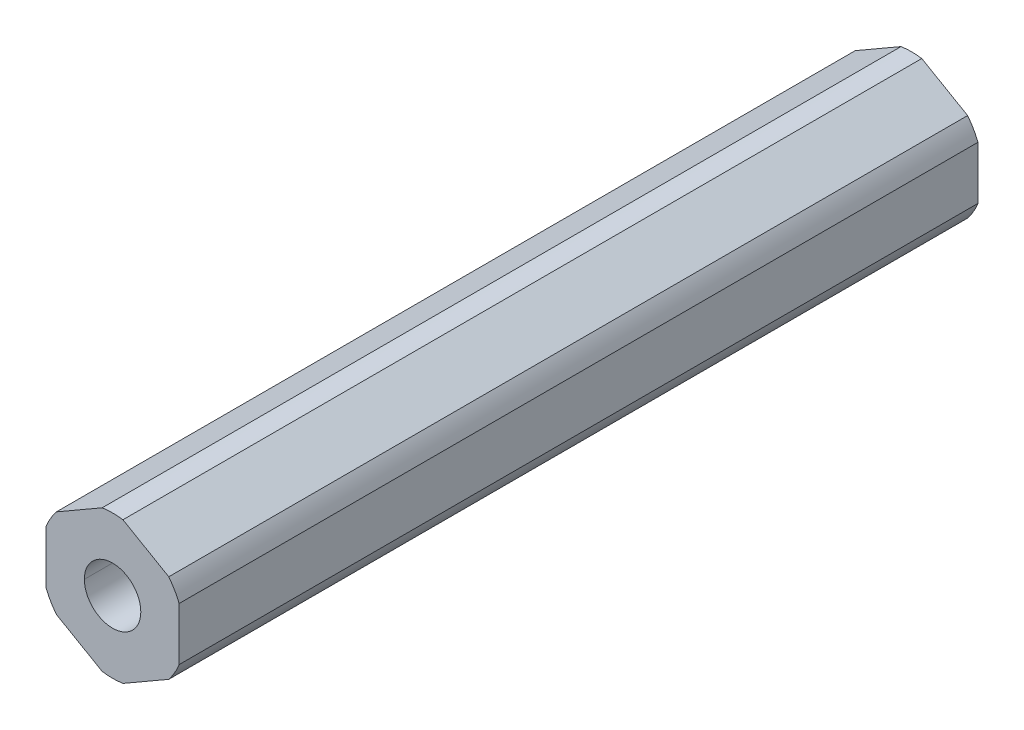
ISO-10303-21;
HEADER;
FILE_DESCRIPTION(('STEP AP214'),'2;1');
FILE_NAME('part.step','',(''),(''),'','','');
FILE_SCHEMA(('AUTOMOTIVE_DESIGN { 1 0 10303 214 1 1 1 1 }'));
ENDSEC;
DATA;
#1=APPLICATION_CONTEXT('core data for automotive mechanical design processes');
#2=APPLICATION_PROTOCOL_DEFINITION('international standard','automotive_design',2000,#1);
#3=PRODUCT_CONTEXT('',#1,'mechanical');
#4=PRODUCT('Part','Part','',(#3));
#5=PRODUCT_RELATED_PRODUCT_CATEGORY('part','',(#4));
#6=PRODUCT_DEFINITION_FORMATION('','',#4);
#7=PRODUCT_DEFINITION_CONTEXT('part definition',#1,'design');
#8=PRODUCT_DEFINITION('design','',#6,#7);
#9=PRODUCT_DEFINITION_SHAPE('','',#8);
#10=(LENGTH_UNIT() NAMED_UNIT(*) SI_UNIT(.MILLI.,.METRE.));
#11=(NAMED_UNIT(*) PLANE_ANGLE_UNIT() SI_UNIT($,.RADIAN.));
#12=(NAMED_UNIT(*) SI_UNIT($,.STERADIAN.) SOLID_ANGLE_UNIT());
#13=UNCERTAINTY_MEASURE_WITH_UNIT(LENGTH_MEASURE(1.E-05),#10,'distance_accuracy_value','');
#14=(GEOMETRIC_REPRESENTATION_CONTEXT(3) GLOBAL_UNCERTAINTY_ASSIGNED_CONTEXT((#13)) GLOBAL_UNIT_ASSIGNED_CONTEXT((#10,
#11,#12)) REPRESENTATION_CONTEXT('',''));
#15=CARTESIAN_POINT('',(0.,0.,0.));
#16=DIRECTION('',(0.,0.,1.));
#17=DIRECTION('',(1.,0.,0.));
#18=AXIS2_PLACEMENT_3D('',#15,#16,#17);
#19=CARTESIAN_POINT('',(0.,0.,-28.575));
#20=DIRECTION('',(0.,0.,-1.));
#21=DIRECTION('',(-1.,0.,0.));
#22=AXIS2_PLACEMENT_3D('',#19,#20,#21);
#23=CYLINDRICAL_SURFACE('',#22,2.0193);
#24=DIRECTION('',(0.,0.,-1.));
#25=VECTOR('',#24,1.);
#26=CARTESIAN_POINT('',(2.0193,0.,-28.575));
#27=LINE('',#26,#25);
#28=CARTESIAN_POINT('',(2.0193,0.,-3.175));
#29=VERTEX_POINT('',#28);
#30=CARTESIAN_POINT('',(2.0193,0.,-28.575));
#31=VERTEX_POINT('',#30);
#32=EDGE_CURVE('E334',#29,#31,#27,.T.);
#33=ORIENTED_EDGE('',*,*,#32,.F.);
#34=CARTESIAN_POINT('',(0.,0.,-3.175));
#35=DIRECTION('',(0.,0.,-1.));
#36=DIRECTION('',(-1.,0.,0.));
#37=AXIS2_PLACEMENT_3D('',#34,#35,#36);
#38=CIRCLE('',#37,2.0193);
#39=CARTESIAN_POINT('',(-2.0193,0.,-3.175));
#40=VERTEX_POINT('',#39);
#41=EDGE_CURVE('E10',#40,#29,#38,.T.);
#42=ORIENTED_EDGE('',*,*,#41,.F.);
#43=DIRECTION('',(0.,0.,-1.));
#44=VECTOR('',#43,1.);
#45=CARTESIAN_POINT('',(-2.0193,0.,-28.575));
#46=LINE('',#45,#44);
#47=CARTESIAN_POINT('',(-2.0193,0.,-28.575));
#48=VERTEX_POINT('',#47);
#49=EDGE_CURVE('E321',#40,#48,#46,.T.);
#50=ORIENTED_EDGE('',*,*,#49,.T.);
#51=CARTESIAN_POINT('',(0.,0.,-28.575));
#52=DIRECTION('',(0.,0.,-1.));
#53=DIRECTION('',(-1.,0.,0.));
#54=AXIS2_PLACEMENT_3D('',#51,#52,#53);
#55=CIRCLE('',#54,2.0193);
#56=EDGE_CURVE('E175',#48,#31,#55,.T.);
#57=ORIENTED_EDGE('',*,*,#56,.T.);
#58=EDGE_LOOP('',(#33,#42,#50,#57));
#59=FACE_BOUND('',#58,.T.);
#60=ADVANCED_FACE('F16',(#59),#23,.F.);
#61=CARTESIAN_POINT('',(0.,0.,-3.175));
#62=DIRECTION('',(0.,0.,-1.));
#63=DIRECTION('',(-1.,0.,0.));
#64=AXIS2_PLACEMENT_3D('',#61,#62,#63);
#65=CONICAL_SURFACE('',#64,2.0193,1.02974425867665);
#66=DIRECTION('',(0.857167300702111,0.,-0.515038074910057));
#67=VECTOR('',#66,1.);
#68=CARTESIAN_POINT('',(2.0193,0.,-3.175));
#69=LINE('',#68,#67);
#70=CARTESIAN_POINT('',(2.01803,0.,-3.17423690701384));
#71=VERTEX_POINT('',#70);
#72=EDGE_CURVE('E243',#71,#29,#69,.T.);
#73=ORIENTED_EDGE('',*,*,#72,.F.);
#74=CARTESIAN_POINT('',(0.,0.,-3.17423690701384));
#75=DIRECTION('',(0.,0.,1.));
#76=DIRECTION('',(-1.,0.,0.));
#77=AXIS2_PLACEMENT_3D('',#74,#75,#76);
#78=CIRCLE('',#77,2.01803);
#79=CARTESIAN_POINT('',(-2.01803,0.,-3.17423690701384));
#80=VERTEX_POINT('',#79);
#81=EDGE_CURVE('E301',#71,#80,#78,.T.);
#82=ORIENTED_EDGE('',*,*,#81,.T.);
#83=DIRECTION('',(-0.857167300702111,0.,-0.515038074910057));
#84=VECTOR('',#83,1.);
#85=CARTESIAN_POINT('',(-2.0193,0.,-3.175));
#86=LINE('',#85,#84);
#87=EDGE_CURVE('E234',#80,#40,#86,.T.);
#88=ORIENTED_EDGE('',*,*,#87,.T.);
#89=ORIENTED_EDGE('',*,*,#41,.T.);
#90=EDGE_LOOP('',(#73,#82,#88,#89));
#91=FACE_BOUND('',#90,.T.);
#92=ADVANCED_FACE('F18',(#91),#65,.F.);
#93=CARTESIAN_POINT('',(0.,0.,28.575));
#94=DIRECTION('',(0.,0.,1.));
#95=DIRECTION('',(1.,0.,0.));
#96=AXIS2_PLACEMENT_3D('',#93,#94,#95);
#97=CYLINDRICAL_SURFACE('',#96,2.0193);
#98=DIRECTION('',(0.,0.,1.));
#99=VECTOR('',#98,1.);
#100=CARTESIAN_POINT('',(-2.0193,0.,28.575));
#101=LINE('',#100,#99);
#102=CARTESIAN_POINT('',(-2.0193,0.,3.175));
#103=VERTEX_POINT('',#102);
#104=CARTESIAN_POINT('',(-2.0193,0.,28.575));
#105=VERTEX_POINT('',#104);
#106=EDGE_CURVE('E202',#103,#105,#101,.T.);
#107=ORIENTED_EDGE('',*,*,#106,.F.);
#108=CARTESIAN_POINT('',(0.,0.,3.175));
#109=DIRECTION('',(0.,0.,1.));
#110=DIRECTION('',(1.,0.,0.));
#111=AXIS2_PLACEMENT_3D('',#108,#109,#110);
#112=CIRCLE('',#111,2.0193);
#113=CARTESIAN_POINT('',(2.0193,0.,3.175));
#114=VERTEX_POINT('',#113);
#115=EDGE_CURVE('E27',#114,#103,#112,.T.);
#116=ORIENTED_EDGE('',*,*,#115,.F.);
#117=DIRECTION('',(0.,0.,1.));
#118=VECTOR('',#117,1.);
#119=CARTESIAN_POINT('',(2.0193,0.,28.575));
#120=LINE('',#119,#118);
#121=CARTESIAN_POINT('',(2.0193,0.,28.575));
#122=VERTEX_POINT('',#121);
#123=EDGE_CURVE('E199',#114,#122,#120,.T.);
#124=ORIENTED_EDGE('',*,*,#123,.T.);
#125=CARTESIAN_POINT('',(0.,0.,28.575));
#126=DIRECTION('',(0.,0.,1.));
#127=DIRECTION('',(1.,0.,0.));
#128=AXIS2_PLACEMENT_3D('',#125,#126,#127);
#129=CIRCLE('',#128,2.0193);
#130=EDGE_CURVE('E208',#122,#105,#129,.T.);
#131=ORIENTED_EDGE('',*,*,#130,.T.);
#132=EDGE_LOOP('',(#107,#116,#124,#131));
#133=FACE_BOUND('',#132,.T.);
#134=ADVANCED_FACE('F197',(#133),#97,.F.);
#135=CARTESIAN_POINT('',(0.,0.,3.175));
#136=DIRECTION('',(0.,0.,1.));
#137=DIRECTION('',(1.,0.,0.));
#138=AXIS2_PLACEMENT_3D('',#135,#136,#137);
#139=CONICAL_SURFACE('',#138,2.0193,1.02974425867665);
#140=DIRECTION('',(-0.857167300702111,0.,0.515038074910057));
#141=VECTOR('',#140,1.);
#142=CARTESIAN_POINT('',(-2.0193,0.,3.175));
#143=LINE('',#142,#141);
#144=CARTESIAN_POINT('',(-2.01803,0.,3.17423690701384));
#145=VERTEX_POINT('',#144);
#146=EDGE_CURVE('E222',#145,#103,#143,.T.);
#147=ORIENTED_EDGE('',*,*,#146,.F.);
#148=CARTESIAN_POINT('',(0.,0.,3.17423690701384));
#149=DIRECTION('',(0.,0.,-1.));
#150=DIRECTION('',(1.,0.,0.));
#151=AXIS2_PLACEMENT_3D('',#148,#149,#150);
#152=CIRCLE('',#151,2.01803);
#153=CARTESIAN_POINT('',(2.01803,0.,3.17423690701384));
#154=VERTEX_POINT('',#153);
#155=EDGE_CURVE('E214',#145,#154,#152,.T.);
#156=ORIENTED_EDGE('',*,*,#155,.T.);
#157=DIRECTION('',(0.857167300702111,0.,0.515038074910057));
#158=VECTOR('',#157,1.);
#159=CARTESIAN_POINT('',(2.0193,0.,3.175));
#160=LINE('',#159,#158);
#161=EDGE_CURVE('E212',#154,#114,#160,.T.);
#162=ORIENTED_EDGE('',*,*,#161,.T.);
#163=ORIENTED_EDGE('',*,*,#115,.T.);
#164=EDGE_LOOP('',(#147,#156,#162,#163));
#165=FACE_BOUND('',#164,.T.);
#166=ADVANCED_FACE('F213',(#165),#139,.F.);
#167=CARTESIAN_POINT('',(0.,0.,28.575));
#168=DIRECTION('',(0.,0.,1.));
#169=DIRECTION('',(1.,0.,0.));
#170=AXIS2_PLACEMENT_3D('',#167,#168,#169);
#171=PLANE('',#170);
#172=ORIENTED_EDGE('',*,*,#130,.F.);
#173=CARTESIAN_POINT('',(0.,0.,28.575));
#174=DIRECTION('',(0.,0.,1.));
#175=DIRECTION('',(1.,0.,0.));
#176=AXIS2_PLACEMENT_3D('',#173,#174,#175);
#177=CIRCLE('',#176,2.0193);
#178=EDGE_CURVE('E228',#105,#122,#177,.T.);
#179=ORIENTED_EDGE('',*,*,#178,.F.);
#180=EDGE_LOOP('',(#172,#179));
#181=FACE_BOUND('',#180,.T.);
#182=DIRECTION('',(0.,1.,0.));
#183=VECTOR('',#182,1.);
#184=CARTESIAN_POINT('',(4.7625,0.,28.575));
#185=LINE('',#184,#183);
#186=CARTESIAN_POINT('',(4.7625,-1.89320330392697,28.575));
#187=VERTEX_POINT('',#186);
#188=CARTESIAN_POINT('',(4.7625,1.89320330392697,28.575));
#189=VERTEX_POINT('',#188);
#190=EDGE_CURVE('E282',#187,#189,#185,.T.);
#191=ORIENTED_EDGE('',*,*,#190,.T.);
#192=CARTESIAN_POINT('',(0.,0.,28.575));
#193=DIRECTION('',(0.,0.,1.));
#194=DIRECTION('',(1.,0.,0.));
#195=AXIS2_PLACEMENT_3D('',#192,#193,#194);
#196=CIRCLE('',#195,5.125);
#197=CARTESIAN_POINT('',(4.02081215572939,3.1778443335599,28.575));
#198=VERTEX_POINT('',#197);
#199=EDGE_CURVE('E78',#189,#198,#196,.T.);
#200=ORIENTED_EDGE('',*,*,#199,.T.);
#201=DIRECTION('',(-0.866025403784439,0.5,0.));
#202=VECTOR('',#201,1.);
#203=CARTESIAN_POINT('',(2.38125,4.12444598552339,28.575));
#204=LINE('',#203,#202);
#205=CARTESIAN_POINT('',(0.741687844270611,5.07104763748688,28.575));
#206=VERTEX_POINT('',#205);
#207=EDGE_CURVE('E250',#198,#206,#204,.T.);
#208=ORIENTED_EDGE('',*,*,#207,.T.);
#209=CARTESIAN_POINT('',(0.,0.,28.575));
#210=DIRECTION('',(0.,0.,1.));
#211=DIRECTION('',(1.,0.,0.));
#212=AXIS2_PLACEMENT_3D('',#209,#210,#211);
#213=CIRCLE('',#212,5.125);
#214=CARTESIAN_POINT('',(-0.741687844270613,5.07104763748687,28.575));
#215=VERTEX_POINT('',#214);
#216=EDGE_CURVE('E288',#206,#215,#213,.T.);
#217=ORIENTED_EDGE('',*,*,#216,.T.);
#218=DIRECTION('',(-0.866025403784439,-0.5,0.));
#219=VECTOR('',#218,1.);
#220=CARTESIAN_POINT('',(-2.38125,4.12444598552339,28.575));
#221=LINE('',#220,#219);
#222=CARTESIAN_POINT('',(-4.02081215572938,3.1778443335599,28.575));
#223=VERTEX_POINT('',#222);
#224=EDGE_CURVE('E269',#215,#223,#221,.T.);
#225=ORIENTED_EDGE('',*,*,#224,.T.);
#226=CARTESIAN_POINT('',(0.,0.,28.575));
#227=DIRECTION('',(0.,0.,1.));
#228=DIRECTION('',(1.,0.,0.));
#229=AXIS2_PLACEMENT_3D('',#226,#227,#228);
#230=CIRCLE('',#229,5.125);
#231=CARTESIAN_POINT('',(-4.7625,1.89320330392697,28.575));
#232=VERTEX_POINT('',#231);
#233=EDGE_CURVE('E295',#223,#232,#230,.T.);
#234=ORIENTED_EDGE('',*,*,#233,.T.);
#235=DIRECTION('',(0.,-1.,0.));
#236=VECTOR('',#235,1.);
#237=CARTESIAN_POINT('',(-4.7625,0.,28.575));
#238=LINE('',#237,#236);
#239=CARTESIAN_POINT('',(-4.7625,-1.89320330392698,28.575));
#240=VERTEX_POINT('',#239);
#241=EDGE_CURVE('E314',#232,#240,#238,.T.);
#242=ORIENTED_EDGE('',*,*,#241,.T.);
#243=CARTESIAN_POINT('',(0.,0.,28.575));
#244=DIRECTION('',(0.,0.,1.));
#245=DIRECTION('',(1.,0.,0.));
#246=AXIS2_PLACEMENT_3D('',#243,#244,#245);
#247=CIRCLE('',#246,5.125);
#248=CARTESIAN_POINT('',(-4.02081215572939,-3.1778443335599,28.575));
#249=VERTEX_POINT('',#248);
#250=EDGE_CURVE('E296',#240,#249,#247,.T.);
#251=ORIENTED_EDGE('',*,*,#250,.T.);
#252=DIRECTION('',(0.866025403784439,-0.5,0.));
#253=VECTOR('',#252,1.);
#254=CARTESIAN_POINT('',(-2.38125,-4.12444598552339,28.575));
#255=LINE('',#254,#253);
#256=CARTESIAN_POINT('',(-0.741687844270614,-5.07104763748688,28.575));
#257=VERTEX_POINT('',#256);
#258=EDGE_CURVE('E305',#249,#257,#255,.T.);
#259=ORIENTED_EDGE('',*,*,#258,.T.);
#260=CARTESIAN_POINT('',(0.,0.,28.575));
#261=DIRECTION('',(0.,0.,1.));
#262=DIRECTION('',(1.,0.,0.));
#263=AXIS2_PLACEMENT_3D('',#260,#261,#262);
#264=CIRCLE('',#263,5.125);
#265=CARTESIAN_POINT('',(0.741687844270609,-5.07104763748688,28.575));
#266=VERTEX_POINT('',#265);
#267=EDGE_CURVE('E268',#257,#266,#264,.T.);
#268=ORIENTED_EDGE('',*,*,#267,.T.);
#269=DIRECTION('',(0.866025403784439,0.5,0.));
#270=VECTOR('',#269,1.);
#271=CARTESIAN_POINT('',(2.38125,-4.12444598552339,28.575));
#272=LINE('',#271,#270);
#273=CARTESIAN_POINT('',(4.02081215572939,-3.1778443335599,28.575));
#274=VERTEX_POINT('',#273);
#275=EDGE_CURVE('E247',#266,#274,#272,.T.);
#276=ORIENTED_EDGE('',*,*,#275,.T.);
#277=CARTESIAN_POINT('',(0.,0.,28.575));
#278=DIRECTION('',(0.,0.,1.));
#279=DIRECTION('',(1.,0.,0.));
#280=AXIS2_PLACEMENT_3D('',#277,#278,#279);
#281=CIRCLE('',#280,5.125);
#282=EDGE_CURVE('E42',#274,#187,#281,.T.);
#283=ORIENTED_EDGE('',*,*,#282,.T.);
#284=EDGE_LOOP('',(#191,#200,#208,#217,#225,#234,#242,#251,#259,#268,#276,#283));
#285=FACE_BOUND('',#284,.T.);
#286=ADVANCED_FACE('F546',(#181,#285),#171,.T.);
#287=CARTESIAN_POINT('',(0.,0.,28.575));
#288=DIRECTION('',(0.,0.,-1.));
#289=DIRECTION('',(-1.,0.,0.));
#290=AXIS2_PLACEMENT_3D('',#287,#288,#289);
#291=CYLINDRICAL_SURFACE('',#290,5.125);
#292=CARTESIAN_POINT('',(0.,0.,-28.575));
#293=DIRECTION('',(0.,0.,1.));
#294=DIRECTION('',(1.,0.,0.));
#295=AXIS2_PLACEMENT_3D('',#292,#293,#294);
#296=CIRCLE('',#295,5.125);
#297=CARTESIAN_POINT('',(4.02081215572939,-3.1778443335599,-28.575));
#298=VERTEX_POINT('',#297);
#299=CARTESIAN_POINT('',(4.7625,-1.89320330392697,-28.575));
#300=VERTEX_POINT('',#299);
#301=EDGE_CURVE('E260',#298,#300,#296,.T.);
#302=ORIENTED_EDGE('',*,*,#301,.T.);
#303=DIRECTION('',(0.,0.,-1.));
#304=VECTOR('',#303,1.);
#305=CARTESIAN_POINT('',(4.7625,-1.89320330392697,28.575));
#306=LINE('',#305,#304);
#307=EDGE_CURVE('E348',#187,#300,#306,.T.);
#308=ORIENTED_EDGE('',*,*,#307,.F.);
#309=ORIENTED_EDGE('',*,*,#282,.F.);
#310=DIRECTION('',(0.,0.,-1.));
#311=VECTOR('',#310,1.);
#312=CARTESIAN_POINT('',(4.02081215572939,-3.1778443335599,28.575));
#313=LINE('',#312,#311);
#314=EDGE_CURVE('E249',#274,#298,#313,.T.);
#315=ORIENTED_EDGE('',*,*,#314,.T.);
#316=EDGE_LOOP('',(#302,#308,#309,#315));
#317=FACE_BOUND('',#316,.T.);
#318=ADVANCED_FACE('F550',(#317),#291,.T.);
#319=CARTESIAN_POINT('',(0.,0.,28.575));
#320=DIRECTION('',(0.,0.,-1.));
#321=DIRECTION('',(-1.,0.,0.));
#322=AXIS2_PLACEMENT_3D('',#319,#320,#321);
#323=CYLINDRICAL_SURFACE('',#322,2.01803);
#324=DIRECTION('',(0.,0.,-1.));
#325=VECTOR('',#324,1.);
#326=CARTESIAN_POINT('',(2.01803,0.,28.575));
#327=LINE('',#326,#325);
#328=EDGE_CURVE('E221',#154,#71,#327,.T.);
#329=ORIENTED_EDGE('',*,*,#328,.F.);
#330=ORIENTED_EDGE('',*,*,#155,.F.);
#331=DIRECTION('',(0.,0.,-1.));
#332=VECTOR('',#331,1.);
#333=CARTESIAN_POINT('',(-2.01803,0.,28.575));
#334=LINE('',#333,#332);
#335=EDGE_CURVE('E355',#145,#80,#334,.T.);
#336=ORIENTED_EDGE('',*,*,#335,.T.);
#337=ORIENTED_EDGE('',*,*,#81,.F.);
#338=EDGE_LOOP('',(#329,#330,#336,#337));
#339=FACE_BOUND('',#338,.T.);
#340=ADVANCED_FACE('F644',(#339),#323,.F.);
#341=CARTESIAN_POINT('',(2.38125,-4.12444598552339,28.575));
#342=DIRECTION('',(-0.5,0.866025403784439,0.));
#343=DIRECTION('',(0.,0.,1.));
#344=AXIS2_PLACEMENT_3D('',#341,#342,#343);
#345=PLANE('',#344);
#346=DIRECTION('',(0.866025403784439,0.5,0.));
#347=VECTOR('',#346,1.);
#348=CARTESIAN_POINT('',(2.38125,-4.12444598552339,-28.575));
#349=LINE('',#348,#347);
#350=CARTESIAN_POINT('',(0.741687844270609,-5.07104763748688,-28.575));
#351=VERTEX_POINT('',#350);
#352=EDGE_CURVE('E264',#351,#298,#349,.T.);
#353=ORIENTED_EDGE('',*,*,#352,.T.);
#354=ORIENTED_EDGE('',*,*,#314,.F.);
#355=ORIENTED_EDGE('',*,*,#275,.F.);
#356=DIRECTION('',(0.,0.,-1.));
#357=VECTOR('',#356,1.);
#358=CARTESIAN_POINT('',(0.741687844270609,-5.07104763748688,28.575));
#359=LINE('',#358,#357);
#360=EDGE_CURVE('E309',#266,#351,#359,.T.);
#361=ORIENTED_EDGE('',*,*,#360,.T.);
#362=EDGE_LOOP('',(#353,#354,#355,#361));
#363=FACE_BOUND('',#362,.T.);
#364=ADVANCED_FACE('F628',(#363),#345,.F.);
#365=CARTESIAN_POINT('',(0.,0.,28.575));
#366=DIRECTION('',(0.,0.,-1.));
#367=DIRECTION('',(-1.,0.,0.));
#368=AXIS2_PLACEMENT_3D('',#365,#366,#367);
#369=CYLINDRICAL_SURFACE('',#368,5.125);
#370=CARTESIAN_POINT('',(0.,0.,-28.575));
#371=DIRECTION('',(0.,0.,1.));
#372=DIRECTION('',(1.,0.,0.));
#373=AXIS2_PLACEMENT_3D('',#370,#371,#372);
#374=CIRCLE('',#373,5.125);
#375=CARTESIAN_POINT('',(-0.741687844270614,-5.07104763748688,-28.575));
#376=VERTEX_POINT('',#375);
#377=EDGE_CURVE('E369',#376,#351,#374,.T.);
#378=ORIENTED_EDGE('',*,*,#377,.T.);
#379=ORIENTED_EDGE('',*,*,#360,.F.);
#380=ORIENTED_EDGE('',*,*,#267,.F.);
#381=DIRECTION('',(0.,0.,-1.));
#382=VECTOR('',#381,1.);
#383=CARTESIAN_POINT('',(-0.741687844270614,-5.07104763748688,28.575));
#384=LINE('',#383,#382);
#385=EDGE_CURVE('E138',#257,#376,#384,.T.);
#386=ORIENTED_EDGE('',*,*,#385,.T.);
#387=EDGE_LOOP('',(#378,#379,#380,#386));
#388=FACE_BOUND('',#387,.T.);
#389=ADVANCED_FACE('F575',(#388),#369,.T.);
#390=CARTESIAN_POINT('',(-2.38125,-4.12444598552339,28.575));
#391=DIRECTION('',(0.5,0.866025403784439,0.));
#392=DIRECTION('',(0.,0.,-1.));
#393=AXIS2_PLACEMENT_3D('',#390,#391,#392);
#394=PLANE('',#393);
#395=DIRECTION('',(0.866025403784439,-0.5,0.));
#396=VECTOR('',#395,1.);
#397=CARTESIAN_POINT('',(-2.38125,-4.12444598552339,-28.575));
#398=LINE('',#397,#396);
#399=CARTESIAN_POINT('',(-4.02081215572939,-3.1778443335599,-28.575));
#400=VERTEX_POINT('',#399);
#401=EDGE_CURVE('E279',#400,#376,#398,.T.);
#402=ORIENTED_EDGE('',*,*,#401,.T.);
#403=ORIENTED_EDGE('',*,*,#385,.F.);
#404=ORIENTED_EDGE('',*,*,#258,.F.);
#405=DIRECTION('',(0.,0.,-1.));
#406=VECTOR('',#405,1.);
#407=CARTESIAN_POINT('',(-4.02081215572939,-3.1778443335599,28.575));
#408=LINE('',#407,#406);
#409=EDGE_CURVE('E122',#249,#400,#408,.T.);
#410=ORIENTED_EDGE('',*,*,#409,.T.);
#411=EDGE_LOOP('',(#402,#403,#404,#410));
#412=FACE_BOUND('',#411,.T.);
#413=ADVANCED_FACE('F571',(#412),#394,.F.);
#414=CARTESIAN_POINT('',(0.,0.,28.575));
#415=DIRECTION('',(0.,0.,-1.));
#416=DIRECTION('',(-1.,0.,0.));
#417=AXIS2_PLACEMENT_3D('',#414,#415,#416);
#418=CYLINDRICAL_SURFACE('',#417,5.125);
#419=CARTESIAN_POINT('',(0.,0.,-28.575));
#420=DIRECTION('',(0.,0.,1.));
#421=DIRECTION('',(1.,0.,0.));
#422=AXIS2_PLACEMENT_3D('',#419,#420,#421);
#423=CIRCLE('',#422,5.125);
#424=CARTESIAN_POINT('',(-4.7625,-1.89320330392698,-28.575));
#425=VERTEX_POINT('',#424);
#426=EDGE_CURVE('E275',#425,#400,#423,.T.);
#427=ORIENTED_EDGE('',*,*,#426,.T.);
#428=ORIENTED_EDGE('',*,*,#409,.F.);
#429=ORIENTED_EDGE('',*,*,#250,.F.);
#430=DIRECTION('',(0.,0.,-1.));
#431=VECTOR('',#430,1.);
#432=CARTESIAN_POINT('',(-4.7625,-1.89320330392698,28.575));
#433=LINE('',#432,#431);
#434=EDGE_CURVE('E366',#240,#425,#433,.T.);
#435=ORIENTED_EDGE('',*,*,#434,.T.);
#436=EDGE_LOOP('',(#427,#428,#429,#435));
#437=FACE_BOUND('',#436,.T.);
#438=ADVANCED_FACE('F540',(#437),#418,.T.);
#439=CARTESIAN_POINT('',(-4.7625,0.,28.575));
#440=DIRECTION('',(1.,0.,0.));
#441=DIRECTION('',(0.,1.,0.));
#442=AXIS2_PLACEMENT_3D('',#439,#440,#441);
#443=PLANE('',#442);
#444=DIRECTION('',(0.,-1.,0.));
#445=VECTOR('',#444,1.);
#446=CARTESIAN_POINT('',(-4.7625,0.,-28.575));
#447=LINE('',#446,#445);
#448=CARTESIAN_POINT('',(-4.7625,1.89320330392697,-28.575));
#449=VERTEX_POINT('',#448);
#450=EDGE_CURVE('E278',#449,#425,#447,.T.);
#451=ORIENTED_EDGE('',*,*,#450,.T.);
#452=ORIENTED_EDGE('',*,*,#434,.F.);
#453=ORIENTED_EDGE('',*,*,#241,.F.);
#454=DIRECTION('',(0.,0.,-1.));
#455=VECTOR('',#454,1.);
#456=CARTESIAN_POINT('',(-4.7625,1.89320330392697,28.575));
#457=LINE('',#456,#455);
#458=EDGE_CURVE('E273',#232,#449,#457,.T.);
#459=ORIENTED_EDGE('',*,*,#458,.T.);
#460=EDGE_LOOP('',(#451,#452,#453,#459));
#461=FACE_BOUND('',#460,.T.);
#462=ADVANCED_FACE('F531',(#461),#443,.F.);
#463=CARTESIAN_POINT('',(0.,0.,28.575));
#464=DIRECTION('',(0.,0.,-1.));
#465=DIRECTION('',(-1.,0.,0.));
#466=AXIS2_PLACEMENT_3D('',#463,#464,#465);
#467=CYLINDRICAL_SURFACE('',#466,5.125);
#468=CARTESIAN_POINT('',(0.,0.,-28.575));
#469=DIRECTION('',(0.,0.,1.));
#470=DIRECTION('',(1.,0.,0.));
#471=AXIS2_PLACEMENT_3D('',#468,#469,#470);
#472=CIRCLE('',#471,5.125);
#473=CARTESIAN_POINT('',(-4.02081215572938,3.1778443335599,-28.575));
#474=VERTEX_POINT('',#473);
#475=EDGE_CURVE('E319',#474,#449,#472,.T.);
#476=ORIENTED_EDGE('',*,*,#475,.T.);
#477=ORIENTED_EDGE('',*,*,#458,.F.);
#478=ORIENTED_EDGE('',*,*,#233,.F.);
#479=DIRECTION('',(0.,0.,-1.));
#480=VECTOR('',#479,1.);
#481=CARTESIAN_POINT('',(-4.02081215572938,3.1778443335599,28.575));
#482=LINE('',#481,#480);
#483=EDGE_CURVE('E274',#223,#474,#482,.T.);
#484=ORIENTED_EDGE('',*,*,#483,.T.);
#485=EDGE_LOOP('',(#476,#477,#478,#484));
#486=FACE_BOUND('',#485,.T.);
#487=ADVANCED_FACE('F522',(#486),#467,.T.);
#488=CARTESIAN_POINT('',(-2.38125,4.12444598552339,28.575));
#489=DIRECTION('',(0.5,-0.866025403784439,0.));
#490=DIRECTION('',(0.,0.,-1.));
#491=AXIS2_PLACEMENT_3D('',#488,#489,#490);
#492=PLANE('',#491);
#493=DIRECTION('',(-0.866025403784439,-0.5,0.));
#494=VECTOR('',#493,1.);
#495=CARTESIAN_POINT('',(-2.38125,4.12444598552339,-28.575));
#496=LINE('',#495,#494);
#497=CARTESIAN_POINT('',(-0.741687844270613,5.07104763748687,-28.575));
#498=VERTEX_POINT('',#497);
#499=EDGE_CURVE('E287',#498,#474,#496,.T.);
#500=ORIENTED_EDGE('',*,*,#499,.T.);
#501=ORIENTED_EDGE('',*,*,#483,.F.);
#502=ORIENTED_EDGE('',*,*,#224,.F.);
#503=DIRECTION('',(0.,0.,-1.));
#504=VECTOR('',#503,1.);
#505=CARTESIAN_POINT('',(-0.741687844270613,5.07104763748687,28.575));
#506=LINE('',#505,#504);
#507=EDGE_CURVE('E254',#215,#498,#506,.T.);
#508=ORIENTED_EDGE('',*,*,#507,.T.);
#509=EDGE_LOOP('',(#500,#501,#502,#508));
#510=FACE_BOUND('',#509,.T.);
#511=ADVANCED_FACE('F518',(#510),#492,.F.);
#512=CARTESIAN_POINT('',(0.,0.,28.575));
#513=DIRECTION('',(0.,0.,-1.));
#514=DIRECTION('',(-1.,0.,0.));
#515=AXIS2_PLACEMENT_3D('',#512,#513,#514);
#516=CYLINDRICAL_SURFACE('',#515,5.125);
#517=CARTESIAN_POINT('',(0.,0.,-28.575));
#518=DIRECTION('',(0.,0.,1.));
#519=DIRECTION('',(1.,0.,0.));
#520=AXIS2_PLACEMENT_3D('',#517,#518,#519);
#521=CIRCLE('',#520,5.125);
#522=CARTESIAN_POINT('',(0.741687844270611,5.07104763748688,-28.575));
#523=VERTEX_POINT('',#522);
#524=EDGE_CURVE('E283',#523,#498,#521,.T.);
#525=ORIENTED_EDGE('',*,*,#524,.T.);
#526=ORIENTED_EDGE('',*,*,#507,.F.);
#527=ORIENTED_EDGE('',*,*,#216,.F.);
#528=DIRECTION('',(0.,0.,-1.));
#529=VECTOR('',#528,1.);
#530=CARTESIAN_POINT('',(0.741687844270611,5.07104763748688,28.575));
#531=LINE('',#530,#529);
#532=EDGE_CURVE('E255',#206,#523,#531,.T.);
#533=ORIENTED_EDGE('',*,*,#532,.T.);
#534=EDGE_LOOP('',(#525,#526,#527,#533));
#535=FACE_BOUND('',#534,.T.);
#536=ADVANCED_FACE('F513',(#535),#516,.T.);
#537=CARTESIAN_POINT('',(2.38125,4.12444598552339,28.575));
#538=DIRECTION('',(-0.5,-0.866025403784439,0.));
#539=DIRECTION('',(-0.866025403784439,0.5,0.));
#540=AXIS2_PLACEMENT_3D('',#537,#538,#539);
#541=PLANE('',#540);
#542=DIRECTION('',(-0.866025403784439,0.5,0.));
#543=VECTOR('',#542,1.);
#544=CARTESIAN_POINT('',(2.38125,4.12444598552339,-28.575));
#545=LINE('',#544,#543);
#546=CARTESIAN_POINT('',(4.02081215572939,3.1778443335599,-28.575));
#547=VERTEX_POINT('',#546);
#548=EDGE_CURVE('E20',#547,#523,#545,.T.);
#549=ORIENTED_EDGE('',*,*,#548,.T.);
#550=ORIENTED_EDGE('',*,*,#532,.F.);
#551=ORIENTED_EDGE('',*,*,#207,.F.);
#552=DIRECTION('',(0.,0.,-1.));
#553=VECTOR('',#552,1.);
#554=CARTESIAN_POINT('',(4.02081215572939,3.1778443335599,28.575));
#555=LINE('',#554,#553);
#556=EDGE_CURVE('E94',#198,#547,#555,.T.);
#557=ORIENTED_EDGE('',*,*,#556,.T.);
#558=EDGE_LOOP('',(#549,#550,#551,#557));
#559=FACE_BOUND('',#558,.T.);
#560=ADVANCED_FACE('F508',(#559),#541,.F.);
#561=CARTESIAN_POINT('',(0.,0.,28.575));
#562=DIRECTION('',(0.,0.,-1.));
#563=DIRECTION('',(-1.,0.,0.));
#564=AXIS2_PLACEMENT_3D('',#561,#562,#563);
#565=CYLINDRICAL_SURFACE('',#564,5.125);
#566=CARTESIAN_POINT('',(0.,0.,-28.575));
#567=DIRECTION('',(0.,0.,1.));
#568=DIRECTION('',(1.,0.,0.));
#569=AXIS2_PLACEMENT_3D('',#566,#567,#568);
#570=CIRCLE('',#569,5.125);
#571=CARTESIAN_POINT('',(4.7625,1.89320330392697,-28.575));
#572=VERTEX_POINT('',#571);
#573=EDGE_CURVE('E259',#572,#547,#570,.T.);
#574=ORIENTED_EDGE('',*,*,#573,.T.);
#575=ORIENTED_EDGE('',*,*,#556,.F.);
#576=ORIENTED_EDGE('',*,*,#199,.F.);
#577=DIRECTION('',(0.,0.,-1.));
#578=VECTOR('',#577,1.);
#579=CARTESIAN_POINT('',(4.7625,1.89320330392697,28.575));
#580=LINE('',#579,#578);
#581=EDGE_CURVE('E258',#189,#572,#580,.T.);
#582=ORIENTED_EDGE('',*,*,#581,.T.);
#583=EDGE_LOOP('',(#574,#575,#576,#582));
#584=FACE_BOUND('',#583,.T.);
#585=ADVANCED_FACE('F512',(#584),#565,.T.);
#586=CARTESIAN_POINT('',(4.7625,0.,28.575));
#587=DIRECTION('',(-1.,0.,0.));
#588=DIRECTION('',(0.,1.,0.));
#589=AXIS2_PLACEMENT_3D('',#586,#587,#588);
#590=PLANE('',#589);
#591=DIRECTION('',(0.,1.,0.));
#592=VECTOR('',#591,1.);
#593=CARTESIAN_POINT('',(4.7625,0.,-28.575));
#594=LINE('',#593,#592);
#595=EDGE_CURVE('E265',#300,#572,#594,.T.);
#596=ORIENTED_EDGE('',*,*,#595,.T.);
#597=ORIENTED_EDGE('',*,*,#581,.F.);
#598=ORIENTED_EDGE('',*,*,#190,.F.);
#599=ORIENTED_EDGE('',*,*,#307,.T.);
#600=EDGE_LOOP('',(#596,#597,#598,#599));
#601=FACE_BOUND('',#600,.T.);
#602=ADVANCED_FACE('F583',(#601),#590,.F.);
#603=CARTESIAN_POINT('',(0.,0.,-28.575));
#604=DIRECTION('',(0.,0.,1.));
#605=DIRECTION('',(1.,0.,0.));
#606=AXIS2_PLACEMENT_3D('',#603,#604,#605);
#607=PLANE('',#606);
#608=ORIENTED_EDGE('',*,*,#56,.F.);
#609=CARTESIAN_POINT('',(0.,0.,-28.575));
#610=DIRECTION('',(0.,0.,-1.));
#611=DIRECTION('',(-1.,0.,0.));
#612=AXIS2_PLACEMENT_3D('',#609,#610,#611);
#613=CIRCLE('',#612,2.0193);
#614=EDGE_CURVE('E324',#31,#48,#613,.T.);
#615=ORIENTED_EDGE('',*,*,#614,.F.);
#616=EDGE_LOOP('',(#608,#615));
#617=FACE_BOUND('',#616,.T.);
#618=ORIENTED_EDGE('',*,*,#595,.F.);
#619=ORIENTED_EDGE('',*,*,#301,.F.);
#620=ORIENTED_EDGE('',*,*,#352,.F.);
#621=ORIENTED_EDGE('',*,*,#377,.F.);
#622=ORIENTED_EDGE('',*,*,#401,.F.);
#623=ORIENTED_EDGE('',*,*,#426,.F.);
#624=ORIENTED_EDGE('',*,*,#450,.F.);
#625=ORIENTED_EDGE('',*,*,#475,.F.);
#626=ORIENTED_EDGE('',*,*,#499,.F.);
#627=ORIENTED_EDGE('',*,*,#524,.F.);
#628=ORIENTED_EDGE('',*,*,#548,.F.);
#629=ORIENTED_EDGE('',*,*,#573,.F.);
#630=EDGE_LOOP('',(#618,#619,#620,#621,#622,#623,#624,#625,#626,#627,#628,#629));
#631=FACE_BOUND('',#630,.T.);
#632=ADVANCED_FACE('F502',(#617,#631),#607,.F.);
#633=CARTESIAN_POINT('',(0.,0.,28.575));
#634=DIRECTION('',(0.,0.,-1.));
#635=DIRECTION('',(-1.,0.,0.));
#636=AXIS2_PLACEMENT_3D('',#633,#634,#635);
#637=CYLINDRICAL_SURFACE('',#636,2.01803);
#638=CARTESIAN_POINT('',(0.,0.,3.17423690701384));
#639=DIRECTION('',(0.,0.,-1.));
#640=DIRECTION('',(1.,0.,0.));
#641=AXIS2_PLACEMENT_3D('',#638,#639,#640);
#642=CIRCLE('',#641,2.01803);
#643=EDGE_CURVE('E230',#154,#145,#642,.T.);
#644=ORIENTED_EDGE('',*,*,#643,.F.);
#645=ORIENTED_EDGE('',*,*,#328,.T.);
#646=CARTESIAN_POINT('',(0.,0.,-3.17423690701384));
#647=DIRECTION('',(0.,0.,1.));
#648=DIRECTION('',(-1.,0.,0.));
#649=AXIS2_PLACEMENT_3D('',#646,#647,#648);
#650=CIRCLE('',#649,2.01803);
#651=EDGE_CURVE('E323',#80,#71,#650,.T.);
#652=ORIENTED_EDGE('',*,*,#651,.F.);
#653=ORIENTED_EDGE('',*,*,#335,.F.);
#654=EDGE_LOOP('',(#644,#645,#652,#653));
#655=FACE_BOUND('',#654,.T.);
#656=ADVANCED_FACE('F498',(#655),#637,.F.);
#657=CARTESIAN_POINT('',(0.,0.,3.175));
#658=DIRECTION('',(0.,0.,1.));
#659=DIRECTION('',(1.,0.,0.));
#660=AXIS2_PLACEMENT_3D('',#657,#658,#659);
#661=CONICAL_SURFACE('',#660,2.0193,1.02974425867665);
#662=ORIENTED_EDGE('',*,*,#643,.T.);
#663=ORIENTED_EDGE('',*,*,#146,.T.);
#664=CARTESIAN_POINT('',(0.,0.,3.175));
#665=DIRECTION('',(0.,0.,1.));
#666=DIRECTION('',(1.,0.,0.));
#667=AXIS2_PLACEMENT_3D('',#664,#665,#666);
#668=CIRCLE('',#667,2.0193);
#669=EDGE_CURVE('E226',#103,#114,#668,.T.);
#670=ORIENTED_EDGE('',*,*,#669,.T.);
#671=ORIENTED_EDGE('',*,*,#161,.F.);
#672=EDGE_LOOP('',(#662,#663,#670,#671));
#673=FACE_BOUND('',#672,.T.);
#674=ADVANCED_FACE('F232',(#673),#661,.F.);
#675=CARTESIAN_POINT('',(0.,0.,28.575));
#676=DIRECTION('',(0.,0.,1.));
#677=DIRECTION('',(1.,0.,0.));
#678=AXIS2_PLACEMENT_3D('',#675,#676,#677);
#679=CYLINDRICAL_SURFACE('',#678,2.0193);
#680=ORIENTED_EDGE('',*,*,#669,.F.);
#681=ORIENTED_EDGE('',*,*,#106,.T.);
#682=ORIENTED_EDGE('',*,*,#178,.T.);
#683=ORIENTED_EDGE('',*,*,#123,.F.);
#684=EDGE_LOOP('',(#680,#681,#682,#683));
#685=FACE_BOUND('',#684,.T.);
#686=ADVANCED_FACE('F225',(#685),#679,.F.);
#687=CARTESIAN_POINT('',(0.,0.,-3.175));
#688=DIRECTION('',(0.,0.,-1.));
#689=DIRECTION('',(-1.,0.,0.));
#690=AXIS2_PLACEMENT_3D('',#687,#688,#689);
#691=CONICAL_SURFACE('',#690,2.0193,1.02974425867665);
#692=ORIENTED_EDGE('',*,*,#651,.T.);
#693=ORIENTED_EDGE('',*,*,#72,.T.);
#694=CARTESIAN_POINT('',(0.,0.,-3.175));
#695=DIRECTION('',(0.,0.,-1.));
#696=DIRECTION('',(-1.,0.,0.));
#697=AXIS2_PLACEMENT_3D('',#694,#695,#696);
#698=CIRCLE('',#697,2.0193);
#699=EDGE_CURVE('E343',#29,#40,#698,.T.);
#700=ORIENTED_EDGE('',*,*,#699,.T.);
#701=ORIENTED_EDGE('',*,*,#87,.F.);
#702=EDGE_LOOP('',(#692,#693,#700,#701));
#703=FACE_BOUND('',#702,.T.);
#704=ADVANCED_FACE('F591',(#703),#691,.F.);
#705=CARTESIAN_POINT('',(0.,0.,-28.575));
#706=DIRECTION('',(0.,0.,-1.));
#707=DIRECTION('',(-1.,0.,0.));
#708=AXIS2_PLACEMENT_3D('',#705,#706,#707);
#709=CYLINDRICAL_SURFACE('',#708,2.0193);
#710=ORIENTED_EDGE('',*,*,#699,.F.);
#711=ORIENTED_EDGE('',*,*,#32,.T.);
#712=ORIENTED_EDGE('',*,*,#614,.T.);
#713=ORIENTED_EDGE('',*,*,#49,.F.);
#714=EDGE_LOOP('',(#710,#711,#712,#713));
#715=FACE_BOUND('',#714,.T.);
#716=ADVANCED_FACE('F603',(#715),#709,.F.);
#717=CLOSED_SHELL('',(#60,#92,#134,#166,#286,#318,#340,#364,#389,#413,#438,#462,#487,#511,#536,
#560,#585,#602,#632,#656,#674,#686,#704,#716));
#718=MANIFOLD_SOLID_BREP('B1',#717);
#719=ADVANCED_BREP_SHAPE_REPRESENTATION('',(#18,#718),#14);
#720=SHAPE_DEFINITION_REPRESENTATION(#9,#719);
ENDSEC;
END-ISO-10303-21;
